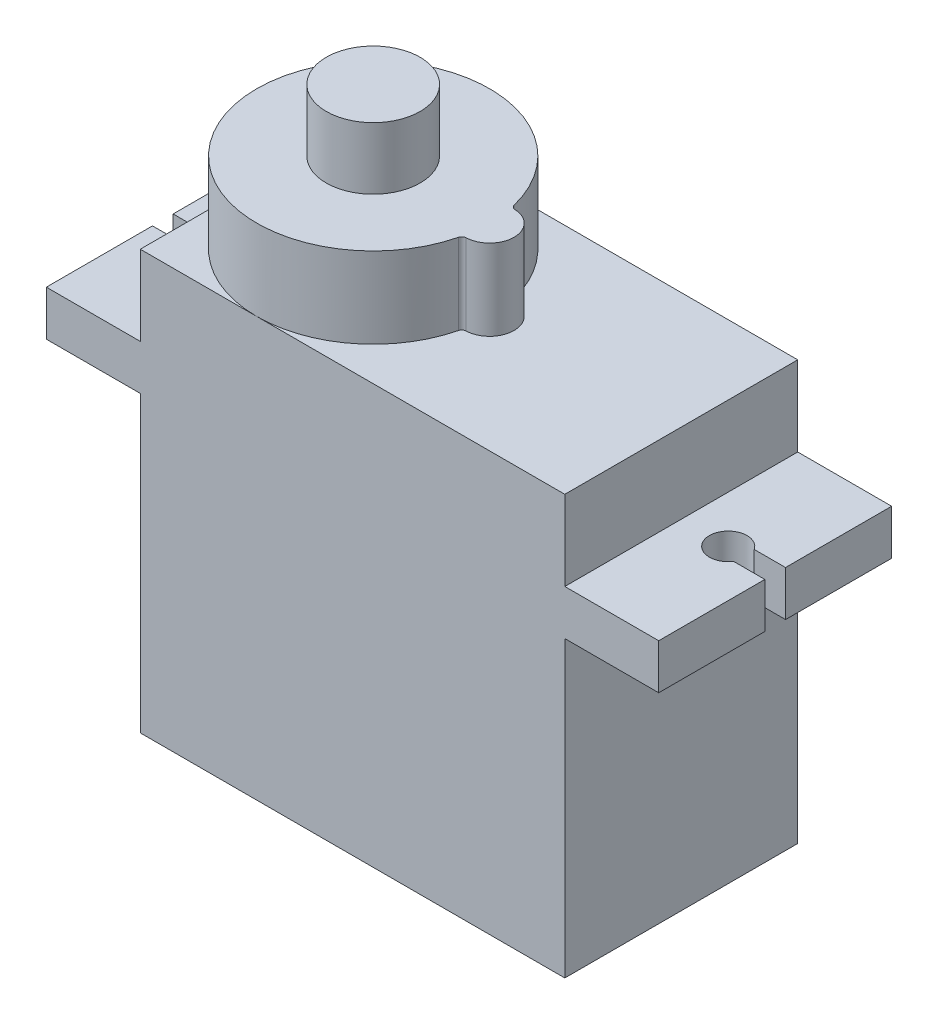
ISO-10303-21;
HEADER;
FILE_DESCRIPTION(('STEP AP214'),'2;1');
FILE_NAME('part.step','',(''),(''),'','','');
FILE_SCHEMA(('AUTOMOTIVE_DESIGN { 1 0 10303 214 1 1 1 1 }'));
ENDSEC;
DATA;
#1=APPLICATION_CONTEXT('core data for automotive mechanical design processes');
#2=APPLICATION_PROTOCOL_DEFINITION('international standard','automotive_design',2000,#1);
#3=PRODUCT_CONTEXT('',#1,'mechanical');
#4=PRODUCT('Part','Part','',(#3));
#5=PRODUCT_RELATED_PRODUCT_CATEGORY('part','',(#4));
#6=PRODUCT_DEFINITION_FORMATION('','',#4);
#7=PRODUCT_DEFINITION_CONTEXT('part definition',#1,'design');
#8=PRODUCT_DEFINITION('design','',#6,#7);
#9=PRODUCT_DEFINITION_SHAPE('','',#8);
#10=(LENGTH_UNIT() NAMED_UNIT(*) SI_UNIT(.MILLI.,.METRE.));
#11=(NAMED_UNIT(*) PLANE_ANGLE_UNIT() SI_UNIT($,.RADIAN.));
#12=(NAMED_UNIT(*) SI_UNIT($,.STERADIAN.) SOLID_ANGLE_UNIT());
#13=UNCERTAINTY_MEASURE_WITH_UNIT(LENGTH_MEASURE(1.E-05),#10,'distance_accuracy_value','');
#14=(GEOMETRIC_REPRESENTATION_CONTEXT(3) GLOBAL_UNCERTAINTY_ASSIGNED_CONTEXT((#13)) GLOBAL_UNIT_ASSIGNED_CONTEXT((#10,
#11,#12)) REPRESENTATION_CONTEXT('',''));
#15=CARTESIAN_POINT('',(0.,0.,0.));
#16=DIRECTION('',(0.,0.,1.));
#17=DIRECTION('',(1.,0.,0.));
#18=AXIS2_PLACEMENT_3D('',#15,#16,#17);
#19=CARTESIAN_POINT('',(-13.6,4.5,0.));
#20=DIRECTION('',(1.,0.,0.));
#21=DIRECTION('',(0.,0.,-1.));
#22=AXIS2_PLACEMENT_3D('',#19,#20,#21);
#23=CYLINDRICAL_SURFACE('',#22,0.6);
#24=CARTESIAN_POINT('',(-13.6,4.5,0.));
#25=DIRECTION('',(-1.,0.,0.));
#26=DIRECTION('',(0.,0.,1.));
#27=AXIS2_PLACEMENT_3D('',#24,#25,#26);
#28=CIRCLE('',#27,0.6);
#29=CARTESIAN_POINT('',(-13.6,4.5,0.600000000000002));
#30=VERTEX_POINT('',#29);
#31=EDGE_CURVE('E12',#30,#30,#28,.T.);
#32=ORIENTED_EDGE('',*,*,#31,.F.);
#33=EDGE_LOOP('',(#32));
#34=FACE_BOUND('',#33,.T.);
#35=CARTESIAN_POINT('',(-11.3,4.5,0.));
#36=DIRECTION('',(-1.,0.,0.));
#37=DIRECTION('',(0.,0.,1.));
#38=AXIS2_PLACEMENT_3D('',#35,#36,#37);
#39=CIRCLE('',#38,0.6);
#40=CARTESIAN_POINT('',(-11.3,4.5,0.600000000000002));
#41=VERTEX_POINT('',#40);
#42=EDGE_CURVE('E62',#41,#41,#39,.T.);
#43=ORIENTED_EDGE('',*,*,#42,.T.);
#44=EDGE_LOOP('',(#43));
#45=FACE_BOUND('',#44,.T.);
#46=ADVANCED_FACE('F59',(#34,#45),#23,.T.);
#47=CARTESIAN_POINT('',(-13.6,0.,0.));
#48=DIRECTION('',(-1.,0.,0.));
#49=DIRECTION('',(0.,0.,1.));
#50=AXIS2_PLACEMENT_3D('',#47,#48,#49);
#51=PLANE('',#50);
#52=ORIENTED_EDGE('',*,*,#31,.T.);
#53=EDGE_LOOP('',(#52));
#54=FACE_BOUND('',#53,.T.);
#55=ADVANCED_FACE('F74',(#54),#51,.T.);
#56=CARTESIAN_POINT('',(-11.3,0.,0.));
#57=DIRECTION('',(-1.,0.,0.));
#58=DIRECTION('',(0.,0.,1.));
#59=AXIS2_PLACEMENT_3D('',#56,#57,#58);
#60=PLANE('',#59);
#61=ORIENTED_EDGE('',*,*,#42,.F.);
#62=EDGE_LOOP('',(#61));
#63=FACE_BOUND('',#62,.T.);
#64=ADVANCED_FACE('F72',(#63),#60,.F.);
#65=CLOSED_SHELL('',(#46,#55,#64));
#66=MANIFOLD_SOLID_BREP('B2',#65);
#67=CARTESIAN_POINT('',(-13.6,4.5,-1.2));
#68=DIRECTION('',(1.,0.,0.));
#69=DIRECTION('',(0.,0.,-1.));
#70=AXIS2_PLACEMENT_3D('',#67,#68,#69);
#71=CYLINDRICAL_SURFACE('',#70,0.6);
#72=CARTESIAN_POINT('',(-13.6,4.5,-1.2));
#73=DIRECTION('',(-1.,0.,0.));
#74=DIRECTION('',(0.,0.,1.));
#75=AXIS2_PLACEMENT_3D('',#72,#73,#74);
#76=CIRCLE('',#75,0.6);
#77=CARTESIAN_POINT('',(-13.6,4.5,-0.599999999999998));
#78=VERTEX_POINT('',#77);
#79=EDGE_CURVE('E58',#78,#78,#76,.T.);
#80=ORIENTED_EDGE('',*,*,#79,.F.);
#81=EDGE_LOOP('',(#80));
#82=FACE_BOUND('',#81,.T.);
#83=CARTESIAN_POINT('',(-11.3,4.5,-1.2));
#84=DIRECTION('',(-1.,0.,0.));
#85=DIRECTION('',(0.,0.,1.));
#86=AXIS2_PLACEMENT_3D('',#83,#84,#85);
#87=CIRCLE('',#86,0.6);
#88=CARTESIAN_POINT('',(-11.3,4.5,-0.599999999999998));
#89=VERTEX_POINT('',#88);
#90=EDGE_CURVE('E120',#89,#89,#87,.T.);
#91=ORIENTED_EDGE('',*,*,#90,.T.);
#92=EDGE_LOOP('',(#91));
#93=FACE_BOUND('',#92,.T.);
#94=ADVANCED_FACE('F117',(#82,#93),#71,.T.);
#95=CARTESIAN_POINT('',(-13.6,0.,0.));
#96=DIRECTION('',(-1.,0.,0.));
#97=DIRECTION('',(0.,0.,1.));
#98=AXIS2_PLACEMENT_3D('',#95,#96,#97);
#99=PLANE('',#98);
#100=ORIENTED_EDGE('',*,*,#79,.T.);
#101=EDGE_LOOP('',(#100));
#102=FACE_BOUND('',#101,.T.);
#103=ADVANCED_FACE('F132',(#102),#99,.T.);
#104=CARTESIAN_POINT('',(-11.3,0.,0.));
#105=DIRECTION('',(-1.,0.,0.));
#106=DIRECTION('',(0.,0.,1.));
#107=AXIS2_PLACEMENT_3D('',#104,#105,#106);
#108=PLANE('',#107);
#109=ORIENTED_EDGE('',*,*,#90,.F.);
#110=EDGE_LOOP('',(#109));
#111=FACE_BOUND('',#110,.T.);
#112=ADVANCED_FACE('F130',(#111),#108,.F.);
#113=CLOSED_SHELL('',(#94,#103,#112));
#114=MANIFOLD_SOLID_BREP('B7',#113);
#115=CARTESIAN_POINT('',(-13.6,4.5,1.2));
#116=DIRECTION('',(1.,0.,0.));
#117=DIRECTION('',(0.,0.,-1.));
#118=AXIS2_PLACEMENT_3D('',#115,#116,#117);
#119=CYLINDRICAL_SURFACE('',#118,0.6);
#120=CARTESIAN_POINT('',(-13.6,4.5,1.2));
#121=DIRECTION('',(-1.,0.,0.));
#122=DIRECTION('',(0.,0.,1.));
#123=AXIS2_PLACEMENT_3D('',#120,#121,#122);
#124=CIRCLE('',#123,0.6);
#125=CARTESIAN_POINT('',(-13.6,4.5,1.8));
#126=VERTEX_POINT('',#125);
#127=EDGE_CURVE('E116',#126,#126,#124,.T.);
#128=ORIENTED_EDGE('',*,*,#127,.F.);
#129=EDGE_LOOP('',(#128));
#130=FACE_BOUND('',#129,.T.);
#131=CARTESIAN_POINT('',(-11.3,4.5,1.2));
#132=DIRECTION('',(-1.,0.,0.));
#133=DIRECTION('',(0.,0.,1.));
#134=AXIS2_PLACEMENT_3D('',#131,#132,#133);
#135=CIRCLE('',#134,0.6);
#136=CARTESIAN_POINT('',(-11.3,4.5,1.8));
#137=VERTEX_POINT('',#136);
#138=EDGE_CURVE('E179',#137,#137,#135,.T.);
#139=ORIENTED_EDGE('',*,*,#138,.T.);
#140=EDGE_LOOP('',(#139));
#141=FACE_BOUND('',#140,.T.);
#142=ADVANCED_FACE('F176',(#130,#141),#119,.T.);
#143=CARTESIAN_POINT('',(-13.6,0.,0.));
#144=DIRECTION('',(-1.,0.,0.));
#145=DIRECTION('',(0.,0.,1.));
#146=AXIS2_PLACEMENT_3D('',#143,#144,#145);
#147=PLANE('',#146);
#148=ORIENTED_EDGE('',*,*,#127,.T.);
#149=EDGE_LOOP('',(#148));
#150=FACE_BOUND('',#149,.T.);
#151=ADVANCED_FACE('F191',(#150),#147,.T.);
#152=CARTESIAN_POINT('',(-11.3,0.,0.));
#153=DIRECTION('',(-1.,0.,0.));
#154=DIRECTION('',(0.,0.,1.));
#155=AXIS2_PLACEMENT_3D('',#152,#153,#154);
#156=PLANE('',#155);
#157=ORIENTED_EDGE('',*,*,#138,.F.);
#158=EDGE_LOOP('',(#157));
#159=FACE_BOUND('',#158,.T.);
#160=ADVANCED_FACE('F189',(#159),#156,.F.);
#161=CLOSED_SHELL('',(#142,#151,#160));
#162=MANIFOLD_SOLID_BREP('B53',#161);
#163=CARTESIAN_POINT('',(0.,22.3,0.));
#164=DIRECTION('',(0.,1.,0.));
#165=DIRECTION('',(0.,0.,1.));
#166=AXIS2_PLACEMENT_3D('',#163,#164,#165);
#167=PLANE('',#166);
#168=CARTESIAN_POINT('',(-5.1,22.3,0.));
#169=DIRECTION('',(0.,1.,0.));
#170=DIRECTION('',(0.,0.,1.));
#171=AXIS2_PLACEMENT_3D('',#168,#169,#170);
#172=CIRCLE('',#171,6.2);
#173=CARTESIAN_POINT('',(-5.1,22.3,-6.2));
#174=VERTEX_POINT('',#173);
#175=CARTESIAN_POINT('',(-11.3,22.3,0.));
#176=VERTEX_POINT('',#175);
#177=EDGE_CURVE('E174',#174,#176,#172,.T.);
#178=ORIENTED_EDGE('',*,*,#177,.F.);
#179=DIRECTION('',(-1.,0.,0.));
#180=VECTOR('',#179,1.);
#181=CARTESIAN_POINT('',(-11.3,22.3,-6.2));
#182=LINE('',#181,#180);
#183=CARTESIAN_POINT('',(-11.3,22.3,-6.2));
#184=VERTEX_POINT('',#183);
#185=EDGE_CURVE('E559',#174,#184,#182,.T.);
#186=ORIENTED_EDGE('',*,*,#185,.T.);
#187=DIRECTION('',(0.,0.,1.));
#188=VECTOR('',#187,1.);
#189=CARTESIAN_POINT('',(-11.3,22.3,-6.2));
#190=LINE('',#189,#188);
#191=EDGE_CURVE('E565',#184,#176,#190,.T.);
#192=ORIENTED_EDGE('',*,*,#191,.T.);
#193=EDGE_LOOP('',(#178,#186,#192));
#194=FACE_BOUND('',#193,.T.);
#195=ADVANCED_FACE('F222',(#194),#167,.T.);
#196=CARTESIAN_POINT('',(-5.1,22.3,6.2));
#197=VERTEX_POINT('',#196);
#198=EDGE_CURVE('E232',#176,#197,#172,.T.);
#199=ORIENTED_EDGE('',*,*,#198,.F.);
#200=CARTESIAN_POINT('',(-11.3,22.3,6.2));
#201=VERTEX_POINT('',#200);
#202=EDGE_CURVE('E564',#176,#201,#190,.T.);
#203=ORIENTED_EDGE('',*,*,#202,.T.);
#204=DIRECTION('',(1.,0.,0.));
#205=VECTOR('',#204,1.);
#206=CARTESIAN_POINT('',(-11.3,22.3,6.2));
#207=LINE('',#206,#205);
#208=EDGE_CURVE('E570',#201,#197,#207,.T.);
#209=ORIENTED_EDGE('',*,*,#208,.T.);
#210=EDGE_LOOP('',(#199,#203,#209));
#211=FACE_BOUND('',#210,.T.);
#212=ADVANCED_FACE('F679',(#211),#167,.T.);
#213=CARTESIAN_POINT('',(16.3,18.05,-6.2));
#214=DIRECTION('',(1.,0.,0.));
#215=DIRECTION('',(0.,0.,-1.));
#216=AXIS2_PLACEMENT_3D('',#213,#214,#215);
#217=PLANE('',#216);
#218=DIRECTION('',(0.,1.,0.));
#219=VECTOR('',#218,1.);
#220=CARTESIAN_POINT('',(16.3,0.,-0.55));
#221=LINE('',#220,#219);
#222=CARTESIAN_POINT('',(16.3,15.65,-0.55));
#223=VERTEX_POINT('',#222);
#224=CARTESIAN_POINT('',(16.3,18.05,-0.55));
#225=VERTEX_POINT('',#224);
#226=EDGE_CURVE('E447',#223,#225,#221,.T.);
#227=ORIENTED_EDGE('',*,*,#226,.F.);
#228=DIRECTION('',(0.,0.,1.));
#229=VECTOR('',#228,1.);
#230=CARTESIAN_POINT('',(16.3,15.65,-6.2));
#231=LINE('',#230,#229);
#232=CARTESIAN_POINT('',(16.3,15.65,-6.2));
#233=VERTEX_POINT('',#232);
#234=EDGE_CURVE('E547',#233,#223,#231,.T.);
#235=ORIENTED_EDGE('',*,*,#234,.F.);
#236=DIRECTION('',(0.,1.,0.));
#237=VECTOR('',#236,1.);
#238=CARTESIAN_POINT('',(16.3,18.05,-6.2));
#239=LINE('',#238,#237);
#240=CARTESIAN_POINT('',(16.3,18.05,-6.2));
#241=VERTEX_POINT('',#240);
#242=EDGE_CURVE('E519',#233,#241,#239,.T.);
#243=ORIENTED_EDGE('',*,*,#242,.T.);
#244=DIRECTION('',(0.,0.,1.));
#245=VECTOR('',#244,1.);
#246=CARTESIAN_POINT('',(16.3,18.05,-6.2));
#247=LINE('',#246,#245);
#248=EDGE_CURVE('E542',#241,#225,#247,.T.);
#249=ORIENTED_EDGE('',*,*,#248,.T.);
#250=EDGE_LOOP('',(#227,#235,#243,#249));
#251=FACE_BOUND('',#250,.T.);
#252=ADVANCED_FACE('F686',(#251),#217,.T.);
#253=CARTESIAN_POINT('',(-16.3,18.05,-6.2));
#254=DIRECTION('',(-1.,0.,0.));
#255=DIRECTION('',(0.,0.,1.));
#256=AXIS2_PLACEMENT_3D('',#253,#254,#255);
#257=PLANE('',#256);
#258=DIRECTION('',(0.,1.,0.));
#259=VECTOR('',#258,1.);
#260=CARTESIAN_POINT('',(-16.3,0.,0.55));
#261=LINE('',#260,#259);
#262=CARTESIAN_POINT('',(-16.3,15.65,0.55));
#263=VERTEX_POINT('',#262);
#264=CARTESIAN_POINT('',(-16.3,18.05,0.55));
#265=VERTEX_POINT('',#264);
#266=EDGE_CURVE('E424',#263,#265,#261,.T.);
#267=ORIENTED_EDGE('',*,*,#266,.F.);
#268=DIRECTION('',(0.,0.,1.));
#269=VECTOR('',#268,1.);
#270=CARTESIAN_POINT('',(-16.3,15.65,-6.2));
#271=LINE('',#270,#269);
#272=CARTESIAN_POINT('',(-16.3,15.65,6.2));
#273=VERTEX_POINT('',#272);
#274=EDGE_CURVE('E480',#263,#273,#271,.T.);
#275=ORIENTED_EDGE('',*,*,#274,.T.);
#276=DIRECTION('',(0.,-1.,0.));
#277=VECTOR('',#276,1.);
#278=CARTESIAN_POINT('',(-16.3,18.05,6.2));
#279=LINE('',#278,#277);
#280=CARTESIAN_POINT('',(-16.3,18.05,6.2));
#281=VERTEX_POINT('',#280);
#282=EDGE_CURVE('E501',#281,#273,#279,.T.);
#283=ORIENTED_EDGE('',*,*,#282,.F.);
#284=DIRECTION('',(0.,0.,1.));
#285=VECTOR('',#284,1.);
#286=CARTESIAN_POINT('',(-16.3,18.05,-6.2));
#287=LINE('',#286,#285);
#288=EDGE_CURVE('E446',#265,#281,#287,.T.);
#289=ORIENTED_EDGE('',*,*,#288,.F.);
#290=EDGE_LOOP('',(#267,#275,#283,#289));
#291=FACE_BOUND('',#290,.T.);
#292=ADVANCED_FACE('F752',(#291),#257,.T.);
#293=CARTESIAN_POINT('',(-11.3,22.3,-6.2));
#294=DIRECTION('',(1.,0.,0.));
#295=DIRECTION('',(0.,0.,-1.));
#296=AXIS2_PLACEMENT_3D('',#293,#294,#295);
#297=PLANE('',#296);
#298=DIRECTION('',(0.,0.,1.));
#299=VECTOR('',#298,1.);
#300=CARTESIAN_POINT('',(-11.3,15.65,-6.2));
#301=LINE('',#300,#299);
#302=CARTESIAN_POINT('',(-11.3,15.65,-6.2));
#303=VERTEX_POINT('',#302);
#304=CARTESIAN_POINT('',(-11.3,15.65,6.2));
#305=VERTEX_POINT('',#304);
#306=EDGE_CURVE('E481',#303,#305,#301,.T.);
#307=ORIENTED_EDGE('',*,*,#306,.F.);
#308=DIRECTION('',(0.,-1.,0.));
#309=VECTOR('',#308,1.);
#310=CARTESIAN_POINT('',(-11.3,22.3,-6.2));
#311=LINE('',#310,#309);
#312=CARTESIAN_POINT('',(-11.3,0.,-6.2));
#313=VERTEX_POINT('',#312);
#314=EDGE_CURVE('E598',#303,#313,#311,.T.);
#315=ORIENTED_EDGE('',*,*,#314,.T.);
#316=DIRECTION('',(0.,0.,1.));
#317=VECTOR('',#316,1.);
#318=CARTESIAN_POINT('',(-11.3,0.,-6.2));
#319=LINE('',#318,#317);
#320=CARTESIAN_POINT('',(-11.3,0.,6.2));
#321=VERTEX_POINT('',#320);
#322=EDGE_CURVE('E582',#313,#321,#319,.T.);
#323=ORIENTED_EDGE('',*,*,#322,.T.);
#324=DIRECTION('',(0.,-1.,0.));
#325=VECTOR('',#324,1.);
#326=CARTESIAN_POINT('',(-11.3,22.3,6.2));
#327=LINE('',#326,#325);
#328=EDGE_CURVE('E593',#305,#321,#327,.T.);
#329=ORIENTED_EDGE('',*,*,#328,.F.);
#330=EDGE_LOOP('',(#307,#315,#323,#329));
#331=FACE_BOUND('',#330,.T.);
#332=ADVANCED_FACE('F778',(#331),#297,.F.);
#333=CARTESIAN_POINT('',(11.3,22.3,-6.2));
#334=DIRECTION('',(-1.,0.,0.));
#335=DIRECTION('',(0.,0.,1.));
#336=AXIS2_PLACEMENT_3D('',#333,#334,#335);
#337=PLANE('',#336);
#338=DIRECTION('',(0.,0.,1.));
#339=VECTOR('',#338,1.);
#340=CARTESIAN_POINT('',(11.3,18.05,-6.2));
#341=LINE('',#340,#339);
#342=CARTESIAN_POINT('',(11.3,18.05,-6.2));
#343=VERTEX_POINT('',#342);
#344=CARTESIAN_POINT('',(11.3,18.05,6.2));
#345=VERTEX_POINT('',#344);
#346=EDGE_CURVE('E538',#343,#345,#341,.T.);
#347=ORIENTED_EDGE('',*,*,#346,.F.);
#348=DIRECTION('',(0.,-1.,0.));
#349=VECTOR('',#348,1.);
#350=CARTESIAN_POINT('',(11.3,22.3,-6.2));
#351=LINE('',#350,#349);
#352=CARTESIAN_POINT('',(11.3,22.3,-6.2));
#353=VERTEX_POINT('',#352);
#354=EDGE_CURVE('E604',#353,#343,#351,.T.);
#355=ORIENTED_EDGE('',*,*,#354,.F.);
#356=DIRECTION('',(0.,0.,-1.));
#357=VECTOR('',#356,1.);
#358=CARTESIAN_POINT('',(11.3,22.3,-6.2));
#359=LINE('',#358,#357);
#360=CARTESIAN_POINT('',(11.3,22.3,6.2));
#361=VERTEX_POINT('',#360);
#362=EDGE_CURVE('E555',#361,#353,#359,.T.);
#363=ORIENTED_EDGE('',*,*,#362,.F.);
#364=DIRECTION('',(0.,-1.,0.));
#365=VECTOR('',#364,1.);
#366=CARTESIAN_POINT('',(11.3,22.3,6.2));
#367=LINE('',#366,#365);
#368=EDGE_CURVE('E589',#361,#345,#367,.T.);
#369=ORIENTED_EDGE('',*,*,#368,.T.);
#370=EDGE_LOOP('',(#347,#355,#363,#369));
#371=FACE_BOUND('',#370,.T.);
#372=ADVANCED_FACE('F719',(#371),#337,.F.);
#373=CARTESIAN_POINT('',(11.3,15.65,-6.2));
#374=VERTEX_POINT('',#373);
#375=CARTESIAN_POINT('',(11.3,0.,-6.2));
#376=VERTEX_POINT('',#375);
#377=EDGE_CURVE('E603',#374,#376,#351,.T.);
#378=ORIENTED_EDGE('',*,*,#377,.F.);
#379=DIRECTION('',(0.,0.,1.));
#380=VECTOR('',#379,1.);
#381=CARTESIAN_POINT('',(11.3,15.65,-6.2));
#382=LINE('',#381,#380);
#383=CARTESIAN_POINT('',(11.3,15.65,6.2));
#384=VERTEX_POINT('',#383);
#385=EDGE_CURVE('E527',#374,#384,#382,.T.);
#386=ORIENTED_EDGE('',*,*,#385,.T.);
#387=CARTESIAN_POINT('',(11.3,0.,6.2));
#388=VERTEX_POINT('',#387);
#389=EDGE_CURVE('E574',#384,#388,#367,.T.);
#390=ORIENTED_EDGE('',*,*,#389,.T.);
#391=DIRECTION('',(0.,0.,-1.));
#392=VECTOR('',#391,1.);
#393=CARTESIAN_POINT('',(11.3,0.,-6.2));
#394=LINE('',#393,#392);
#395=EDGE_CURVE('E541',#388,#376,#394,.T.);
#396=ORIENTED_EDGE('',*,*,#395,.T.);
#397=EDGE_LOOP('',(#378,#386,#390,#396));
#398=FACE_BOUND('',#397,.T.);
#399=ADVANCED_FACE('F224',(#398),#337,.F.);
#400=CARTESIAN_POINT('',(-11.3,22.3,-6.2));
#401=DIRECTION('',(0.,0.,1.));
#402=DIRECTION('',(1.,0.,0.));
#403=AXIS2_PLACEMENT_3D('',#400,#401,#402);
#404=PLANE('',#403);
#405=DIRECTION('',(-1.,0.,0.));
#406=VECTOR('',#405,1.);
#407=CARTESIAN_POINT('',(-11.3,0.,-6.2));
#408=LINE('',#407,#406);
#409=EDGE_CURVE('E578',#376,#313,#408,.T.);
#410=ORIENTED_EDGE('',*,*,#409,.T.);
#411=ORIENTED_EDGE('',*,*,#314,.F.);
#412=DIRECTION('',(1.,0.,0.));
#413=VECTOR('',#412,1.);
#414=CARTESIAN_POINT('',(-16.3,15.65,-6.2));
#415=LINE('',#414,#413);
#416=CARTESIAN_POINT('',(-16.3,15.65,-6.2));
#417=VERTEX_POINT('',#416);
#418=EDGE_CURVE('E509',#417,#303,#415,.T.);
#419=ORIENTED_EDGE('',*,*,#418,.F.);
#420=DIRECTION('',(0.,-1.,0.));
#421=VECTOR('',#420,1.);
#422=CARTESIAN_POINT('',(-16.3,18.05,-6.2));
#423=LINE('',#422,#421);
#424=CARTESIAN_POINT('',(-16.3,18.05,-6.2));
#425=VERTEX_POINT('',#424);
#426=EDGE_CURVE('E497',#425,#417,#423,.T.);
#427=ORIENTED_EDGE('',*,*,#426,.F.);
#428=DIRECTION('',(-1.,0.,0.));
#429=VECTOR('',#428,1.);
#430=CARTESIAN_POINT('',(-16.3,18.05,-6.2));
#431=LINE('',#430,#429);
#432=CARTESIAN_POINT('',(-11.3,18.05,-6.2));
#433=VERTEX_POINT('',#432);
#434=EDGE_CURVE('E479',#433,#425,#431,.T.);
#435=ORIENTED_EDGE('',*,*,#434,.F.);
#436=EDGE_CURVE('E599',#184,#433,#311,.T.);
#437=ORIENTED_EDGE('',*,*,#436,.F.);
#438=ORIENTED_EDGE('',*,*,#185,.F.);
#439=EDGE_CURVE('E561',#353,#174,#182,.T.);
#440=ORIENTED_EDGE('',*,*,#439,.F.);
#441=ORIENTED_EDGE('',*,*,#354,.T.);
#442=DIRECTION('',(-1.,0.,0.));
#443=VECTOR('',#442,1.);
#444=CARTESIAN_POINT('',(16.3,18.05,-6.2));
#445=LINE('',#444,#443);
#446=EDGE_CURVE('E524',#241,#343,#445,.T.);
#447=ORIENTED_EDGE('',*,*,#446,.F.);
#448=ORIENTED_EDGE('',*,*,#242,.F.);
#449=DIRECTION('',(1.,0.,0.));
#450=VECTOR('',#449,1.);
#451=CARTESIAN_POINT('',(16.3,15.65,-6.2));
#452=LINE('',#451,#450);
#453=EDGE_CURVE('E515',#374,#233,#452,.T.);
#454=ORIENTED_EDGE('',*,*,#453,.F.);
#455=ORIENTED_EDGE('',*,*,#377,.T.);
#456=EDGE_LOOP('',(#410,#411,#419,#427,#435,#437,#438,#440,#441,#447,#448,#454,#455));
#457=FACE_BOUND('',#456,.T.);
#458=ADVANCED_FACE('F713',(#457),#404,.F.);
#459=ORIENTED_EDGE('',*,*,#436,.T.);
#460=DIRECTION('',(0.,0.,1.));
#461=VECTOR('',#460,1.);
#462=CARTESIAN_POINT('',(-11.3,18.05,-6.2));
#463=LINE('',#462,#461);
#464=CARTESIAN_POINT('',(-11.3,18.05,6.2));
#465=VERTEX_POINT('',#464);
#466=EDGE_CURVE('E484',#433,#465,#463,.T.);
#467=ORIENTED_EDGE('',*,*,#466,.T.);
#468=EDGE_CURVE('E594',#201,#465,#327,.T.);
#469=ORIENTED_EDGE('',*,*,#468,.F.);
#470=ORIENTED_EDGE('',*,*,#202,.F.);
#471=ORIENTED_EDGE('',*,*,#191,.F.);
#472=EDGE_LOOP('',(#459,#467,#469,#470,#471));
#473=FACE_BOUND('',#472,.T.);
#474=ADVANCED_FACE('F699',(#473),#297,.F.);
#475=CARTESIAN_POINT('',(-11.3,22.3,6.2));
#476=DIRECTION('',(0.,0.,-1.));
#477=DIRECTION('',(-1.,0.,0.));
#478=AXIS2_PLACEMENT_3D('',#475,#476,#477);
#479=PLANE('',#478);
#480=DIRECTION('',(1.,0.,0.));
#481=VECTOR('',#480,1.);
#482=CARTESIAN_POINT('',(-11.3,0.,6.2));
#483=LINE('',#482,#481);
#484=EDGE_CURVE('E560',#321,#388,#483,.T.);
#485=ORIENTED_EDGE('',*,*,#484,.T.);
#486=ORIENTED_EDGE('',*,*,#389,.F.);
#487=DIRECTION('',(1.,0.,0.));
#488=VECTOR('',#487,1.);
#489=CARTESIAN_POINT('',(16.3,15.65,6.2));
#490=LINE('',#489,#488);
#491=CARTESIAN_POINT('',(16.3,15.65,6.2));
#492=VERTEX_POINT('',#491);
#493=EDGE_CURVE('E505',#384,#492,#490,.T.);
#494=ORIENTED_EDGE('',*,*,#493,.T.);
#495=DIRECTION('',(0.,1.,0.));
#496=VECTOR('',#495,1.);
#497=CARTESIAN_POINT('',(16.3,18.05,6.2));
#498=LINE('',#497,#496);
#499=CARTESIAN_POINT('',(16.3,18.05,6.2));
#500=VERTEX_POINT('',#499);
#501=EDGE_CURVE('E531',#492,#500,#498,.T.);
#502=ORIENTED_EDGE('',*,*,#501,.T.);
#503=DIRECTION('',(-1.,0.,0.));
#504=VECTOR('',#503,1.);
#505=CARTESIAN_POINT('',(16.3,18.05,6.2));
#506=LINE('',#505,#504);
#507=EDGE_CURVE('E520',#500,#345,#506,.T.);
#508=ORIENTED_EDGE('',*,*,#507,.T.);
#509=ORIENTED_EDGE('',*,*,#368,.F.);
#510=EDGE_CURVE('E569',#197,#361,#207,.T.);
#511=ORIENTED_EDGE('',*,*,#510,.F.);
#512=ORIENTED_EDGE('',*,*,#208,.F.);
#513=ORIENTED_EDGE('',*,*,#468,.T.);
#514=DIRECTION('',(-1.,0.,0.));
#515=VECTOR('',#514,1.);
#516=CARTESIAN_POINT('',(-16.3,18.05,6.2));
#517=LINE('',#516,#515);
#518=EDGE_CURVE('E492',#465,#281,#517,.T.);
#519=ORIENTED_EDGE('',*,*,#518,.T.);
#520=ORIENTED_EDGE('',*,*,#282,.T.);
#521=DIRECTION('',(1.,0.,0.));
#522=VECTOR('',#521,1.);
#523=CARTESIAN_POINT('',(-16.3,15.65,6.2));
#524=LINE('',#523,#522);
#525=EDGE_CURVE('E496',#273,#305,#524,.T.);
#526=ORIENTED_EDGE('',*,*,#525,.T.);
#527=ORIENTED_EDGE('',*,*,#328,.T.);
#528=EDGE_LOOP('',(#485,#486,#494,#502,#508,#509,#511,#512,#513,#519,#520,#526,#527));
#529=FACE_BOUND('',#528,.T.);
#530=ADVANCED_FACE('F692',(#529),#479,.F.);
#531=CARTESIAN_POINT('',(0.918604651162788,22.3,1.48875721761529));
#532=VERTEX_POINT('',#531);
#533=EDGE_CURVE('E626',#197,#532,#172,.T.);
#534=ORIENTED_EDGE('',*,*,#533,.F.);
#535=ORIENTED_EDGE('',*,*,#510,.T.);
#536=ORIENTED_EDGE('',*,*,#362,.T.);
#537=ORIENTED_EDGE('',*,*,#439,.T.);
#538=CARTESIAN_POINT('',(0.918604651162788,22.3,-1.48875721761529));
#539=VERTEX_POINT('',#538);
#540=EDGE_CURVE('E234',#539,#174,#172,.T.);
#541=ORIENTED_EDGE('',*,*,#540,.F.);
#542=CARTESIAN_POINT('',(1.16129032258064,22.3,-1.54878775058365));
#543=DIRECTION('',(0.,-1.,0.));
#544=DIRECTION('',(0.,0.,-1.));
#545=AXIS2_PLACEMENT_3D('',#542,#543,#544);
#546=CIRCLE('',#545,0.25);
#547=CARTESIAN_POINT('',(1.15140478668054,22.3,-1.29898327468306));
#548=VERTEX_POINT('',#547);
#549=EDGE_CURVE('E637',#548,#539,#546,.T.);
#550=ORIENTED_EDGE('',*,*,#549,.F.);
#551=CARTESIAN_POINT('',(1.1,22.3,0.));
#552=DIRECTION('',(0.,1.,0.));
#553=DIRECTION('',(0.,0.,1.));
#554=AXIS2_PLACEMENT_3D('',#551,#552,#553);
#555=CIRCLE('',#554,1.3);
#556=CARTESIAN_POINT('',(1.15140478668054,22.3,1.29898327468306));
#557=VERTEX_POINT('',#556);
#558=EDGE_CURVE('E640',#557,#548,#555,.T.);
#559=ORIENTED_EDGE('',*,*,#558,.F.);
#560=CARTESIAN_POINT('',(1.16129032258064,22.3,1.54878775058365));
#561=DIRECTION('',(0.,-1.,0.));
#562=DIRECTION('',(0.,0.,1.));
#563=AXIS2_PLACEMENT_3D('',#560,#561,#562);
#564=CIRCLE('',#563,0.25);
#565=EDGE_CURVE('E241',#532,#557,#564,.T.);
#566=ORIENTED_EDGE('',*,*,#565,.F.);
#567=EDGE_LOOP('',(#534,#535,#536,#537,#541,#550,#559,#566));
#568=FACE_BOUND('',#567,.T.);
#569=ADVANCED_FACE('F682',(#568),#167,.T.);
#570=CARTESIAN_POINT('',(0.,0.,0.));
#571=DIRECTION('',(0.,1.,0.));
#572=DIRECTION('',(0.,0.,1.));
#573=AXIS2_PLACEMENT_3D('',#570,#571,#572);
#574=PLANE('',#573);
#575=ORIENTED_EDGE('',*,*,#395,.F.);
#576=ORIENTED_EDGE('',*,*,#484,.F.);
#577=ORIENTED_EDGE('',*,*,#322,.F.);
#578=ORIENTED_EDGE('',*,*,#409,.F.);
#579=EDGE_LOOP('',(#575,#576,#577,#578));
#580=FACE_BOUND('',#579,.T.);
#581=ADVANCED_FACE('F691',(#580),#574,.F.);
#582=CARTESIAN_POINT('',(16.3,18.05,-6.2));
#583=DIRECTION('',(0.,1.,0.));
#584=DIRECTION('',(0.,0.,1.));
#585=AXIS2_PLACEMENT_3D('',#582,#583,#584);
#586=PLANE('',#585);
#587=DIRECTION('',(-1.,0.,0.));
#588=VECTOR('',#587,1.);
#589=CARTESIAN_POINT('',(14.6351646544245,18.05,-0.55));
#590=LINE('',#589,#588);
#591=CARTESIAN_POINT('',(14.6351646544245,18.05,-0.55));
#592=VERTEX_POINT('',#591);
#593=EDGE_CURVE('E438',#225,#592,#590,.T.);
#594=ORIENTED_EDGE('',*,*,#593,.F.);
#595=ORIENTED_EDGE('',*,*,#248,.F.);
#596=ORIENTED_EDGE('',*,*,#446,.T.);
#597=ORIENTED_EDGE('',*,*,#346,.T.);
#598=ORIENTED_EDGE('',*,*,#507,.F.);
#599=CARTESIAN_POINT('',(16.3,18.05,0.55));
#600=VERTEX_POINT('',#599);
#601=EDGE_CURVE('E546',#600,#500,#247,.T.);
#602=ORIENTED_EDGE('',*,*,#601,.F.);
#603=DIRECTION('',(1.,0.,0.));
#604=VECTOR('',#603,1.);
#605=CARTESIAN_POINT('',(16.3,18.05,0.55));
#606=LINE('',#605,#604);
#607=CARTESIAN_POINT('',(14.6351646544245,18.05,0.55));
#608=VERTEX_POINT('',#607);
#609=EDGE_CURVE('E434',#608,#600,#606,.T.);
#610=ORIENTED_EDGE('',*,*,#609,.F.);
#611=CARTESIAN_POINT('',(13.8,18.05,0.));
#612=DIRECTION('',(0.,1.,0.));
#613=DIRECTION('',(0.,0.,1.));
#614=AXIS2_PLACEMENT_3D('',#611,#612,#613);
#615=CIRCLE('',#614,1.);
#616=EDGE_CURVE('E430',#592,#608,#615,.T.);
#617=ORIENTED_EDGE('',*,*,#616,.F.);
#618=EDGE_LOOP('',(#594,#595,#596,#597,#598,#602,#610,#617));
#619=FACE_BOUND('',#618,.T.);
#620=ADVANCED_FACE('F697',(#619),#586,.T.);
#621=DIRECTION('',(0.,1.,0.));
#622=VECTOR('',#621,1.);
#623=CARTESIAN_POINT('',(16.3,0.,0.55));
#624=LINE('',#623,#622);
#625=CARTESIAN_POINT('',(16.3,15.65,0.549999999999998));
#626=VERTEX_POINT('',#625);
#627=EDGE_CURVE('E450',#626,#600,#624,.T.);
#628=ORIENTED_EDGE('',*,*,#627,.T.);
#629=ORIENTED_EDGE('',*,*,#601,.T.);
#630=ORIENTED_EDGE('',*,*,#501,.F.);
#631=EDGE_CURVE('E551',#626,#492,#231,.T.);
#632=ORIENTED_EDGE('',*,*,#631,.F.);
#633=EDGE_LOOP('',(#628,#629,#630,#632));
#634=FACE_BOUND('',#633,.T.);
#635=ADVANCED_FACE('F785',(#634),#217,.T.);
#636=CARTESIAN_POINT('',(16.3,15.65,-6.2));
#637=DIRECTION('',(0.,-1.,0.));
#638=DIRECTION('',(0.,0.,-1.));
#639=AXIS2_PLACEMENT_3D('',#636,#637,#638);
#640=PLANE('',#639);
#641=DIRECTION('',(1.,0.,0.));
#642=VECTOR('',#641,1.);
#643=CARTESIAN_POINT('',(16.3,15.65,-0.55));
#644=LINE('',#643,#642);
#645=CARTESIAN_POINT('',(14.6351646544245,15.65,-0.55));
#646=VERTEX_POINT('',#645);
#647=EDGE_CURVE('E226',#646,#223,#644,.T.);
#648=ORIENTED_EDGE('',*,*,#647,.F.);
#649=CARTESIAN_POINT('',(13.8,15.65,0.));
#650=DIRECTION('',(0.,-1.,0.));
#651=DIRECTION('',(0.,0.,-1.));
#652=AXIS2_PLACEMENT_3D('',#649,#650,#651);
#653=CIRCLE('',#652,1.);
#654=CARTESIAN_POINT('',(14.6351646544245,15.65,0.55));
#655=VERTEX_POINT('',#654);
#656=EDGE_CURVE('E619',#655,#646,#653,.T.);
#657=ORIENTED_EDGE('',*,*,#656,.F.);
#658=DIRECTION('',(-1.,0.,0.));
#659=VECTOR('',#658,1.);
#660=CARTESIAN_POINT('',(16.3,15.65,0.55));
#661=LINE('',#660,#659);
#662=EDGE_CURVE('E617',#626,#655,#661,.T.);
#663=ORIENTED_EDGE('',*,*,#662,.F.);
#664=ORIENTED_EDGE('',*,*,#631,.T.);
#665=ORIENTED_EDGE('',*,*,#493,.F.);
#666=ORIENTED_EDGE('',*,*,#385,.F.);
#667=ORIENTED_EDGE('',*,*,#453,.T.);
#668=ORIENTED_EDGE('',*,*,#234,.T.);
#669=EDGE_LOOP('',(#648,#657,#663,#664,#665,#666,#667,#668));
#670=FACE_BOUND('',#669,.T.);
#671=ADVANCED_FACE('F729',(#670),#640,.T.);
#672=DIRECTION('',(0.,1.,0.));
#673=VECTOR('',#672,1.);
#674=CARTESIAN_POINT('',(-16.3,0.,-0.55));
#675=LINE('',#674,#673);
#676=CARTESIAN_POINT('',(-16.3,15.65,-0.550000000000002));
#677=VERTEX_POINT('',#676);
#678=CARTESIAN_POINT('',(-16.3,18.05,-0.55));
#679=VERTEX_POINT('',#678);
#680=EDGE_CURVE('E460',#677,#679,#675,.T.);
#681=ORIENTED_EDGE('',*,*,#680,.T.);
#682=EDGE_CURVE('E488',#425,#679,#287,.T.);
#683=ORIENTED_EDGE('',*,*,#682,.F.);
#684=ORIENTED_EDGE('',*,*,#426,.T.);
#685=EDGE_CURVE('E475',#417,#677,#271,.T.);
#686=ORIENTED_EDGE('',*,*,#685,.T.);
#687=EDGE_LOOP('',(#681,#683,#684,#686));
#688=FACE_BOUND('',#687,.T.);
#689=ADVANCED_FACE('F760',(#688),#257,.T.);
#690=CARTESIAN_POINT('',(-16.3,18.05,-6.2));
#691=DIRECTION('',(0.,1.,0.));
#692=DIRECTION('',(0.,0.,1.));
#693=AXIS2_PLACEMENT_3D('',#690,#691,#692);
#694=PLANE('',#693);
#695=DIRECTION('',(1.,0.,0.));
#696=VECTOR('',#695,1.);
#697=CARTESIAN_POINT('',(-16.3,18.05,0.55));
#698=LINE('',#697,#696);
#699=CARTESIAN_POINT('',(-14.6351646544245,18.05,0.55));
#700=VERTEX_POINT('',#699);
#701=EDGE_CURVE('E459',#265,#700,#698,.T.);
#702=ORIENTED_EDGE('',*,*,#701,.F.);
#703=ORIENTED_EDGE('',*,*,#288,.T.);
#704=ORIENTED_EDGE('',*,*,#518,.F.);
#705=ORIENTED_EDGE('',*,*,#466,.F.);
#706=ORIENTED_EDGE('',*,*,#434,.T.);
#707=ORIENTED_EDGE('',*,*,#682,.T.);
#708=DIRECTION('',(-1.,0.,0.));
#709=VECTOR('',#708,1.);
#710=CARTESIAN_POINT('',(-14.6351646544245,18.05,-0.55));
#711=LINE('',#710,#709);
#712=CARTESIAN_POINT('',(-14.6351646544245,18.05,-0.55));
#713=VERTEX_POINT('',#712);
#714=EDGE_CURVE('E469',#713,#679,#711,.T.);
#715=ORIENTED_EDGE('',*,*,#714,.F.);
#716=CARTESIAN_POINT('',(-13.8,18.05,0.));
#717=DIRECTION('',(0.,1.,0.));
#718=DIRECTION('',(0.,0.,-1.));
#719=AXIS2_PLACEMENT_3D('',#716,#717,#718);
#720=CIRCLE('',#719,1.);
#721=EDGE_CURVE('E435',#700,#713,#720,.T.);
#722=ORIENTED_EDGE('',*,*,#721,.F.);
#723=EDGE_LOOP('',(#702,#703,#704,#705,#706,#707,#715,#722));
#724=FACE_BOUND('',#723,.T.);
#725=ADVANCED_FACE('F748',(#724),#694,.T.);
#726=CARTESIAN_POINT('',(-16.3,15.65,-6.2));
#727=DIRECTION('',(0.,-1.,0.));
#728=DIRECTION('',(0.,0.,-1.));
#729=AXIS2_PLACEMENT_3D('',#726,#727,#728);
#730=PLANE('',#729);
#731=DIRECTION('',(-1.,0.,0.));
#732=VECTOR('',#731,1.);
#733=CARTESIAN_POINT('',(-16.3,15.65,0.55));
#734=LINE('',#733,#732);
#735=CARTESIAN_POINT('',(-14.6351646544245,15.65,0.55));
#736=VERTEX_POINT('',#735);
#737=EDGE_CURVE('E614',#736,#263,#734,.T.);
#738=ORIENTED_EDGE('',*,*,#737,.F.);
#739=CARTESIAN_POINT('',(-13.8,15.65,0.));
#740=DIRECTION('',(0.,-1.,0.));
#741=DIRECTION('',(0.,0.,-1.));
#742=AXIS2_PLACEMENT_3D('',#739,#740,#741);
#743=CIRCLE('',#742,1.);
#744=CARTESIAN_POINT('',(-14.6351646544245,15.65,-0.55));
#745=VERTEX_POINT('',#744);
#746=EDGE_CURVE('E611',#745,#736,#743,.T.);
#747=ORIENTED_EDGE('',*,*,#746,.F.);
#748=DIRECTION('',(1.,0.,0.));
#749=VECTOR('',#748,1.);
#750=CARTESIAN_POINT('',(-16.3,15.65,-0.55));
#751=LINE('',#750,#749);
#752=EDGE_CURVE('E608',#677,#745,#751,.T.);
#753=ORIENTED_EDGE('',*,*,#752,.F.);
#754=ORIENTED_EDGE('',*,*,#685,.F.);
#755=ORIENTED_EDGE('',*,*,#418,.T.);
#756=ORIENTED_EDGE('',*,*,#306,.T.);
#757=ORIENTED_EDGE('',*,*,#525,.F.);
#758=ORIENTED_EDGE('',*,*,#274,.F.);
#759=EDGE_LOOP('',(#738,#747,#753,#754,#755,#756,#757,#758));
#760=FACE_BOUND('',#759,.T.);
#761=ADVANCED_FACE('F774',(#760),#730,.T.);
#762=CARTESIAN_POINT('',(-13.8,0.,0.));
#763=DIRECTION('',(0.,1.,0.));
#764=DIRECTION('',(0.,0.,1.));
#765=AXIS2_PLACEMENT_3D('',#762,#763,#764);
#766=CYLINDRICAL_SURFACE('',#765,1.);
#767=ORIENTED_EDGE('',*,*,#746,.T.);
#768=DIRECTION('',(0.,1.,0.));
#769=VECTOR('',#768,1.);
#770=CARTESIAN_POINT('',(-14.6351646544245,0.,0.55));
#771=LINE('',#770,#769);
#772=EDGE_CURVE('E420',#736,#700,#771,.T.);
#773=ORIENTED_EDGE('',*,*,#772,.T.);
#774=ORIENTED_EDGE('',*,*,#721,.T.);
#775=DIRECTION('',(0.,1.,0.));
#776=VECTOR('',#775,1.);
#777=CARTESIAN_POINT('',(-14.6351646544245,0.,-0.55));
#778=LINE('',#777,#776);
#779=EDGE_CURVE('E456',#745,#713,#778,.T.);
#780=ORIENTED_EDGE('',*,*,#779,.F.);
#781=EDGE_LOOP('',(#767,#773,#774,#780));
#782=FACE_BOUND('',#781,.T.);
#783=ADVANCED_FACE('F768',(#782),#766,.F.);
#784=CARTESIAN_POINT('',(-16.3,0.,0.55));
#785=DIRECTION('',(0.,0.,1.));
#786=DIRECTION('',(1.,0.,0.));
#787=AXIS2_PLACEMENT_3D('',#784,#785,#786);
#788=PLANE('',#787);
#789=ORIENTED_EDGE('',*,*,#737,.T.);
#790=ORIENTED_EDGE('',*,*,#266,.T.);
#791=ORIENTED_EDGE('',*,*,#701,.T.);
#792=ORIENTED_EDGE('',*,*,#772,.F.);
#793=EDGE_LOOP('',(#789,#790,#791,#792));
#794=FACE_BOUND('',#793,.T.);
#795=ADVANCED_FACE('F772',(#794),#788,.F.);
#796=CARTESIAN_POINT('',(-14.6351646544245,0.,-0.55));
#797=DIRECTION('',(0.,0.,-1.));
#798=DIRECTION('',(-1.,0.,0.));
#799=AXIS2_PLACEMENT_3D('',#796,#797,#798);
#800=PLANE('',#799);
#801=ORIENTED_EDGE('',*,*,#752,.T.);
#802=ORIENTED_EDGE('',*,*,#779,.T.);
#803=ORIENTED_EDGE('',*,*,#714,.T.);
#804=ORIENTED_EDGE('',*,*,#680,.F.);
#805=EDGE_LOOP('',(#801,#802,#803,#804));
#806=FACE_BOUND('',#805,.T.);
#807=ADVANCED_FACE('F763',(#806),#800,.F.);
#808=CARTESIAN_POINT('',(13.8,0.,0.));
#809=DIRECTION('',(0.,1.,0.));
#810=DIRECTION('',(0.,0.,1.));
#811=AXIS2_PLACEMENT_3D('',#808,#809,#810);
#812=CYLINDRICAL_SURFACE('',#811,1.);
#813=ORIENTED_EDGE('',*,*,#656,.T.);
#814=DIRECTION('',(0.,1.,0.));
#815=VECTOR('',#814,1.);
#816=CARTESIAN_POINT('',(14.6351646544245,0.,-0.55));
#817=LINE('',#816,#815);
#818=EDGE_CURVE('E443',#646,#592,#817,.T.);
#819=ORIENTED_EDGE('',*,*,#818,.T.);
#820=ORIENTED_EDGE('',*,*,#616,.T.);
#821=DIRECTION('',(0.,1.,0.));
#822=VECTOR('',#821,1.);
#823=CARTESIAN_POINT('',(14.6351646544245,0.,0.55));
#824=LINE('',#823,#822);
#825=EDGE_CURVE('E442',#655,#608,#824,.T.);
#826=ORIENTED_EDGE('',*,*,#825,.F.);
#827=EDGE_LOOP('',(#813,#819,#820,#826));
#828=FACE_BOUND('',#827,.T.);
#829=ADVANCED_FACE('F790',(#828),#812,.F.);
#830=CARTESIAN_POINT('',(14.6351646544245,0.,-0.55));
#831=DIRECTION('',(0.,0.,-1.));
#832=DIRECTION('',(-1.,0.,0.));
#833=AXIS2_PLACEMENT_3D('',#830,#831,#832);
#834=PLANE('',#833);
#835=ORIENTED_EDGE('',*,*,#647,.T.);
#836=ORIENTED_EDGE('',*,*,#226,.T.);
#837=ORIENTED_EDGE('',*,*,#593,.T.);
#838=ORIENTED_EDGE('',*,*,#818,.F.);
#839=EDGE_LOOP('',(#835,#836,#837,#838));
#840=FACE_BOUND('',#839,.T.);
#841=ADVANCED_FACE('F791',(#840),#834,.F.);
#842=CARTESIAN_POINT('',(16.3,0.,0.55));
#843=DIRECTION('',(0.,0.,1.));
#844=DIRECTION('',(1.,0.,0.));
#845=AXIS2_PLACEMENT_3D('',#842,#843,#844);
#846=PLANE('',#845);
#847=ORIENTED_EDGE('',*,*,#662,.T.);
#848=ORIENTED_EDGE('',*,*,#825,.T.);
#849=ORIENTED_EDGE('',*,*,#609,.T.);
#850=ORIENTED_EDGE('',*,*,#627,.F.);
#851=EDGE_LOOP('',(#847,#848,#849,#850));
#852=FACE_BOUND('',#851,.T.);
#853=ADVANCED_FACE('F789',(#852),#846,.F.);
#854=CARTESIAN_POINT('',(1.16129032258064,26.6,1.54878775058365));
#855=DIRECTION('',(0.,-1.,0.));
#856=DIRECTION('',(0.,0.,-1.));
#857=AXIS2_PLACEMENT_3D('',#854,#855,#856);
#858=CYLINDRICAL_SURFACE('',#857,0.25);
#859=ORIENTED_EDGE('',*,*,#565,.T.);
#860=DIRECTION('',(0.,-1.,0.));
#861=VECTOR('',#860,1.);
#862=CARTESIAN_POINT('',(1.15140478668054,26.6,1.29898327468306));
#863=LINE('',#862,#861);
#864=CARTESIAN_POINT('',(1.15140478668054,26.6,1.29898327468306));
#865=VERTEX_POINT('',#864);
#866=EDGE_CURVE('E400',#865,#557,#863,.T.);
#867=ORIENTED_EDGE('',*,*,#866,.F.);
#868=CARTESIAN_POINT('',(1.16129032258064,26.6,1.54878775058365));
#869=DIRECTION('',(0.,-1.,0.));
#870=DIRECTION('',(0.,0.,1.));
#871=AXIS2_PLACEMENT_3D('',#868,#869,#870);
#872=CIRCLE('',#871,0.25);
#873=CARTESIAN_POINT('',(0.918604651162788,26.6,1.48875721761529));
#874=VERTEX_POINT('',#873);
#875=EDGE_CURVE('E407',#874,#865,#872,.T.);
#876=ORIENTED_EDGE('',*,*,#875,.F.);
#877=DIRECTION('',(0.,-1.,0.));
#878=VECTOR('',#877,1.);
#879=CARTESIAN_POINT('',(0.918604651162788,26.6,1.48875721761529));
#880=LINE('',#879,#878);
#881=EDGE_CURVE('E651',#874,#532,#880,.T.);
#882=ORIENTED_EDGE('',*,*,#881,.T.);
#883=EDGE_LOOP('',(#859,#867,#876,#882));
#884=FACE_BOUND('',#883,.T.);
#885=ADVANCED_FACE('F418',(#884),#858,.F.);
#886=CARTESIAN_POINT('',(1.1,26.6,0.));
#887=DIRECTION('',(0.,-1.,0.));
#888=DIRECTION('',(0.,0.,-1.));
#889=AXIS2_PLACEMENT_3D('',#886,#887,#888);
#890=CYLINDRICAL_SURFACE('',#889,1.3);
#891=ORIENTED_EDGE('',*,*,#558,.T.);
#892=DIRECTION('',(0.,-1.,0.));
#893=VECTOR('',#892,1.);
#894=CARTESIAN_POINT('',(1.15140478668054,26.6,-1.29898327468306));
#895=LINE('',#894,#893);
#896=CARTESIAN_POINT('',(1.15140478668054,26.6,-1.29898327468306));
#897=VERTEX_POINT('',#896);
#898=EDGE_CURVE('E402',#897,#548,#895,.T.);
#899=ORIENTED_EDGE('',*,*,#898,.F.);
#900=CARTESIAN_POINT('',(1.1,26.6,0.));
#901=DIRECTION('',(0.,1.,0.));
#902=DIRECTION('',(0.,0.,1.));
#903=AXIS2_PLACEMENT_3D('',#900,#901,#902);
#904=CIRCLE('',#903,1.3);
#905=EDGE_CURVE('E395',#865,#897,#904,.T.);
#906=ORIENTED_EDGE('',*,*,#905,.F.);
#907=ORIENTED_EDGE('',*,*,#866,.T.);
#908=EDGE_LOOP('',(#891,#899,#906,#907));
#909=FACE_BOUND('',#908,.T.);
#910=ADVANCED_FACE('F398',(#909),#890,.T.);
#911=CARTESIAN_POINT('',(1.16129032258064,26.6,-1.54878775058365));
#912=DIRECTION('',(0.,-1.,0.));
#913=DIRECTION('',(0.,0.,-1.));
#914=AXIS2_PLACEMENT_3D('',#911,#912,#913);
#915=CYLINDRICAL_SURFACE('',#914,0.25);
#916=ORIENTED_EDGE('',*,*,#549,.T.);
#917=DIRECTION('',(0.,-1.,0.));
#918=VECTOR('',#917,1.);
#919=CARTESIAN_POINT('',(0.918604651162788,26.6,-1.48875721761529));
#920=LINE('',#919,#918);
#921=CARTESIAN_POINT('',(0.918604651162788,26.6,-1.48875721761529));
#922=VERTEX_POINT('',#921);
#923=EDGE_CURVE('E426',#922,#539,#920,.T.);
#924=ORIENTED_EDGE('',*,*,#923,.F.);
#925=CARTESIAN_POINT('',(1.16129032258064,26.6,-1.54878775058365));
#926=DIRECTION('',(0.,-1.,0.));
#927=DIRECTION('',(0.,0.,-1.));
#928=AXIS2_PLACEMENT_3D('',#925,#926,#927);
#929=CIRCLE('',#928,0.25);
#930=EDGE_CURVE('E406',#897,#922,#929,.T.);
#931=ORIENTED_EDGE('',*,*,#930,.F.);
#932=ORIENTED_EDGE('',*,*,#898,.T.);
#933=EDGE_LOOP('',(#916,#924,#931,#932));
#934=FACE_BOUND('',#933,.T.);
#935=ADVANCED_FACE('F676',(#934),#915,.F.);
#936=CARTESIAN_POINT('',(-5.1,26.6,0.));
#937=DIRECTION('',(0.,-1.,0.));
#938=DIRECTION('',(0.,0.,-1.));
#939=AXIS2_PLACEMENT_3D('',#936,#937,#938);
#940=CYLINDRICAL_SURFACE('',#939,6.2);
#941=ORIENTED_EDGE('',*,*,#540,.T.);
#942=ORIENTED_EDGE('',*,*,#177,.T.);
#943=ORIENTED_EDGE('',*,*,#198,.T.);
#944=ORIENTED_EDGE('',*,*,#533,.T.);
#945=ORIENTED_EDGE('',*,*,#881,.F.);
#946=CARTESIAN_POINT('',(-5.1,26.6,0.));
#947=DIRECTION('',(0.,1.,0.));
#948=DIRECTION('',(0.,0.,1.));
#949=AXIS2_PLACEMENT_3D('',#946,#947,#948);
#950=CIRCLE('',#949,6.2);
#951=EDGE_CURVE('E412',#922,#874,#950,.T.);
#952=ORIENTED_EDGE('',*,*,#951,.F.);
#953=ORIENTED_EDGE('',*,*,#923,.T.);
#954=EDGE_LOOP('',(#941,#942,#943,#944,#945,#952,#953));
#955=FACE_BOUND('',#954,.T.);
#956=ADVANCED_FACE('F671',(#955),#940,.T.);
#957=CARTESIAN_POINT('',(-1.96935483870968,26.6,0.774393875291825));
#958=DIRECTION('',(0.,1.,0.));
#959=DIRECTION('',(0.,0.,1.));
#960=AXIS2_PLACEMENT_3D('',#957,#958,#959);
#961=PLANE('',#960);
#962=CARTESIAN_POINT('',(-5.1,26.6,0.));
#963=DIRECTION('',(0.,1.,0.));
#964=DIRECTION('',(0.,0.,1.));
#965=AXIS2_PLACEMENT_3D('',#962,#963,#964);
#966=CIRCLE('',#965,2.5);
#967=CARTESIAN_POINT('',(-5.1,26.6,2.5));
#968=VERTEX_POINT('',#967);
#969=EDGE_CURVE('E654',#968,#968,#966,.T.);
#970=ORIENTED_EDGE('',*,*,#969,.F.);
#971=EDGE_LOOP('',(#970));
#972=FACE_BOUND('',#971,.T.);
#973=ORIENTED_EDGE('',*,*,#875,.T.);
#974=ORIENTED_EDGE('',*,*,#905,.T.);
#975=ORIENTED_EDGE('',*,*,#930,.T.);
#976=ORIENTED_EDGE('',*,*,#951,.T.);
#977=EDGE_LOOP('',(#973,#974,#975,#976));
#978=FACE_BOUND('',#977,.T.);
#979=ADVANCED_FACE('F410',(#972,#978),#961,.T.);
#980=CARTESIAN_POINT('',(-5.1,29.9,0.));
#981=DIRECTION('',(0.,-1.,0.));
#982=DIRECTION('',(0.,0.,-1.));
#983=AXIS2_PLACEMENT_3D('',#980,#981,#982);
#984=CYLINDRICAL_SURFACE('',#983,2.5);
#985=CARTESIAN_POINT('',(-5.1,29.9,0.));
#986=DIRECTION('',(0.,1.,0.));
#987=DIRECTION('',(0.,0.,1.));
#988=AXIS2_PLACEMENT_3D('',#985,#986,#987);
#989=CIRCLE('',#988,2.5);
#990=CARTESIAN_POINT('',(-5.1,29.9,2.5));
#991=VERTEX_POINT('',#990);
#992=EDGE_CURVE('E648',#991,#991,#989,.T.);
#993=ORIENTED_EDGE('',*,*,#992,.F.);
#994=EDGE_LOOP('',(#993));
#995=FACE_BOUND('',#994,.T.);
#996=ORIENTED_EDGE('',*,*,#969,.T.);
#997=EDGE_LOOP('',(#996));
#998=FACE_BOUND('',#997,.T.);
#999=ADVANCED_FACE('F664',(#995,#998),#984,.T.);
#1000=CARTESIAN_POINT('',(-5.1,29.9,0.));
#1001=DIRECTION('',(0.,1.,0.));
#1002=DIRECTION('',(0.,0.,1.));
#1003=AXIS2_PLACEMENT_3D('',#1000,#1001,#1002);
#1004=PLANE('',#1003);
#1005=ORIENTED_EDGE('',*,*,#992,.T.);
#1006=EDGE_LOOP('',(#1005));
#1007=FACE_BOUND('',#1006,.T.);
#1008=ADVANCED_FACE('F662',(#1007),#1004,.T.);
#1009=CLOSED_SHELL('',(#195,#212,#252,#292,#332,#372,#399,#458,#474,#530,#569,#581,#620,#635,
#671,#689,#725,#761,#783,#795,#807,#829,#841,#853,#885,#910,#935,#956,#979,#999,#1008));
#1010=MANIFOLD_SOLID_BREP('B111',#1009);
#1011=ADVANCED_BREP_SHAPE_REPRESENTATION('',(#18,#66,#114,#162,#1010),#14);
#1012=SHAPE_DEFINITION_REPRESENTATION(#9,#1011);
ENDSEC;
END-ISO-10303-21;
